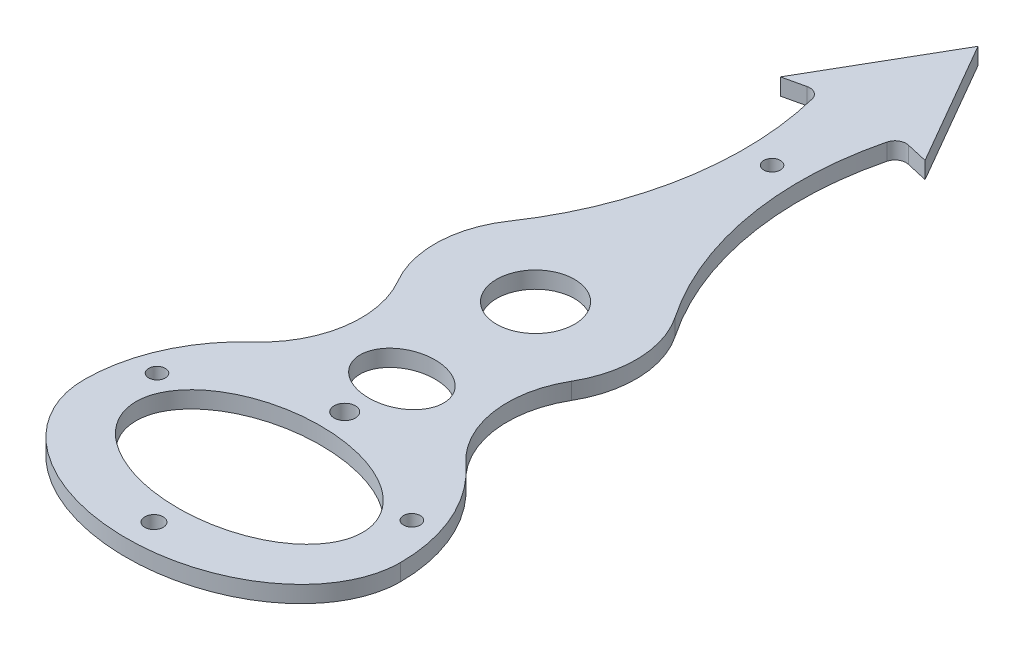
ISO-10303-21;
HEADER;
FILE_DESCRIPTION(('STEP AP214'),'2;1');
FILE_NAME('part.step','',(''),(''),'','','');
FILE_SCHEMA(('AUTOMOTIVE_DESIGN { 1 0 10303 214 1 1 1 1 }'));
ENDSEC;
DATA;
#1=APPLICATION_CONTEXT('core data for automotive mechanical design processes');
#2=APPLICATION_PROTOCOL_DEFINITION('international standard','automotive_design',2000,#1);
#3=PRODUCT_CONTEXT('',#1,'mechanical');
#4=PRODUCT('Part','Part','',(#3));
#5=PRODUCT_RELATED_PRODUCT_CATEGORY('part','',(#4));
#6=PRODUCT_DEFINITION_FORMATION('','',#4);
#7=PRODUCT_DEFINITION_CONTEXT('part definition',#1,'design');
#8=PRODUCT_DEFINITION('design','',#6,#7);
#9=PRODUCT_DEFINITION_SHAPE('','',#8);
#10=(LENGTH_UNIT() NAMED_UNIT(*) SI_UNIT(.MILLI.,.METRE.));
#11=(NAMED_UNIT(*) PLANE_ANGLE_UNIT() SI_UNIT($,.RADIAN.));
#12=(NAMED_UNIT(*) SI_UNIT($,.STERADIAN.) SOLID_ANGLE_UNIT());
#13=UNCERTAINTY_MEASURE_WITH_UNIT(LENGTH_MEASURE(1.E-05),#10,'distance_accuracy_value','');
#14=(GEOMETRIC_REPRESENTATION_CONTEXT(3) GLOBAL_UNCERTAINTY_ASSIGNED_CONTEXT((#13)) GLOBAL_UNIT_ASSIGNED_CONTEXT((#10,
#11,#12)) REPRESENTATION_CONTEXT('',''));
#15=CARTESIAN_POINT('',(0.,0.,0.));
#16=DIRECTION('',(0.,0.,1.));
#17=DIRECTION('',(1.,0.,0.));
#18=AXIS2_PLACEMENT_3D('',#15,#16,#17);
#19=CARTESIAN_POINT('',(0.,3.,52.6898309283418));
#20=DIRECTION('',(0.,-1.,0.));
#21=DIRECTION('',(0.,0.,-1.));
#22=AXIS2_PLACEMENT_3D('',#19,#20,#21);
#23=PLANE('',#22);
#24=CARTESIAN_POINT('',(0.,3.,51.4172932330827));
#25=DIRECTION('',(0.,1.,0.));
#26=DIRECTION('',(1.,0.,0.));
#27=AXIS2_PLACEMENT_3D('',#24,#25,#26);
#28=ELLIPSE('',#27,20.3627513784206,12.8129502592751);
#29=CARTESIAN_POINT('',(20.3627513784206,3.,51.4172932330827));
#30=VERTEX_POINT('',#29);
#31=EDGE_CURVE('E400',#30,#30,#28,.T.);
#32=ORIENTED_EDGE('',*,*,#31,.F.);
#33=EDGE_LOOP('',(#32));
#34=FACE_BOUND('',#33,.T.);
#35=CARTESIAN_POINT('',(0.,3.,24.0072199359122));
#36=DIRECTION('',(0.,1.,0.));
#37=DIRECTION('',(-1.,0.,0.));
#38=AXIS2_PLACEMENT_3D('',#35,#36,#37);
#39=ELLIPSE('',#38,7.5,5.94482806772379);
#40=CARTESIAN_POINT('',(-7.5,3.,24.0072199359122));
#41=VERTEX_POINT('',#40);
#42=EDGE_CURVE('E393',#41,#41,#39,.T.);
#43=ORIENTED_EDGE('',*,*,#42,.F.);
#44=EDGE_LOOP('',(#43));
#45=FACE_BOUND('',#44,.T.);
#46=DIRECTION('',(0.974987658580331,0.,-0.222259005702906));
#47=VECTOR('',#46,1.);
#48=CARTESIAN_POINT('',(-12.99280916861,3.,-56.9957943869207));
#49=LINE('',#48,#47);
#50=CARTESIAN_POINT('',(-12.99280916861,3.,-56.9957943869207));
#51=VERTEX_POINT('',#50);
#52=CARTESIAN_POINT('',(-9.09285853428872,3.,-57.8848304097323));
#53=VERTEX_POINT('',#52);
#54=EDGE_CURVE('E202',#51,#53,#49,.T.);
#55=ORIENTED_EDGE('',*,*,#54,.T.);
#56=CARTESIAN_POINT('',(-8.6483405228829,3.,-55.9348550925716));
#57=DIRECTION('',(0.,-1.,0.));
#58=DIRECTION('',(0.,0.,-1.));
#59=AXIS2_PLACEMENT_3D('',#56,#57,#58);
#60=CIRCLE('',#59,2.00000000000003);
#61=CARTESIAN_POINT('',(-6.70763481825483,3.,-56.4182404130193));
#62=VERTEX_POINT('',#61);
#63=EDGE_CURVE('E115',#53,#62,#60,.T.);
#64=ORIENTED_EDGE('',*,*,#63,.T.);
#65=CARTESIAN_POINT('',(-62.598620829956,3.,-42.4970765194051));
#66=DIRECTION('',(0.,-1.,0.));
#67=DIRECTION('',(0.,0.,1.));
#68=AXIS2_PLACEMENT_3D('',#65,#66,#67);
#69=CIRCLE('',#68,57.598620829956);
#70=CARTESIAN_POINT('',(-14.9440349728036,3.,-10.1452362580485));
#71=VERTEX_POINT('',#70);
#72=EDGE_CURVE('E238',#62,#71,#69,.T.);
#73=ORIENTED_EDGE('',*,*,#72,.T.);
#74=CARTESIAN_POINT('',(0.,3.,0.));
#75=DIRECTION('',(0.,1.,0.));
#76=DIRECTION('',(0.,0.,-1.));
#77=AXIS2_PLACEMENT_3D('',#74,#75,#76);
#78=CIRCLE('',#77,18.0623918681885);
#79=CARTESIAN_POINT('',(-15.6011791105288,3.,9.1023738860366));
#80=VERTEX_POINT('',#79);
#81=EDGE_CURVE('E257',#71,#80,#78,.T.);
#82=ORIENTED_EDGE('',*,*,#81,.T.);
#83=CARTESIAN_POINT('',(-31.2023582210575,3.,18.2047477720732));
#84=DIRECTION('',(0.,-1.,0.));
#85=DIRECTION('',(0.,0.,1.));
#86=AXIS2_PLACEMENT_3D('',#83,#84,#85);
#87=CIRCLE('',#86,18.0623918681884);
#88=CARTESIAN_POINT('',(-19.0837238382742,3.,31.5983544818591));
#89=VERTEX_POINT('',#88);
#90=EDGE_CURVE('E254',#80,#89,#87,.T.);
#91=ORIENTED_EDGE('',*,*,#90,.T.);
#92=CARTESIAN_POINT('',(5.41233724504764E-13,3.,52.6898309283421));
#93=DIRECTION('',(0.,1.,0.));
#94=DIRECTION('',(0.,0.,1.));
#95=AXIS2_PLACEMENT_3D('',#92,#93,#94);
#96=CIRCLE('',#95,28.4436090225569);
#97=CARTESIAN_POINT('',(-28.4436090225564,3.,52.6898309283423));
#98=VERTEX_POINT('',#97);
#99=EDGE_CURVE('E256',#89,#98,#96,.T.);
#100=ORIENTED_EDGE('',*,*,#99,.T.);
#101=CARTESIAN_POINT('',(0.,3.,52.6898309283418));
#102=DIRECTION('',(0.,1.,0.));
#103=DIRECTION('',(-1.,0.,0.));
#104=AXIS2_PLACEMENT_3D('',#101,#102,#103);
#105=ELLIPSE('',#104,28.4436090225564,20.8665600491018);
#106=CARTESIAN_POINT('',(28.4436090225566,3.,52.6898309283418));
#107=VERTEX_POINT('',#106);
#108=EDGE_CURVE('E259',#98,#107,#105,.T.);
#109=ORIENTED_EDGE('',*,*,#108,.T.);
#110=CARTESIAN_POINT('',(5.41233724504764E-13,3.,52.6898309283421));
#111=DIRECTION('',(0.,1.,0.));
#112=DIRECTION('',(0.,0.,-1.));
#113=AXIS2_PLACEMENT_3D('',#110,#111,#112);
#114=CIRCLE('',#113,28.443609022556);
#115=CARTESIAN_POINT('',(19.0837238382742,3.,31.5983544818591));
#116=VERTEX_POINT('',#115);
#117=EDGE_CURVE('E266',#107,#116,#114,.T.);
#118=ORIENTED_EDGE('',*,*,#117,.T.);
#119=CARTESIAN_POINT('',(31.2023582210575,3.,18.2047477720732));
#120=DIRECTION('',(0.,-1.,0.));
#121=DIRECTION('',(0.,0.,-1.));
#122=AXIS2_PLACEMENT_3D('',#119,#120,#121);
#123=CIRCLE('',#122,18.0623918681884);
#124=CARTESIAN_POINT('',(15.6011791105288,3.,9.1023738860366));
#125=VERTEX_POINT('',#124);
#126=EDGE_CURVE('E346',#116,#125,#123,.T.);
#127=ORIENTED_EDGE('',*,*,#126,.T.);
#128=CARTESIAN_POINT('',(0.,3.,0.));
#129=DIRECTION('',(0.,1.,0.));
#130=DIRECTION('',(0.,0.,1.));
#131=AXIS2_PLACEMENT_3D('',#128,#129,#130);
#132=CIRCLE('',#131,18.0623918681884);
#133=CARTESIAN_POINT('',(14.9440349728036,3.,-10.1452362580485));
#134=VERTEX_POINT('',#133);
#135=EDGE_CURVE('E338',#125,#134,#132,.T.);
#136=ORIENTED_EDGE('',*,*,#135,.T.);
#137=CARTESIAN_POINT('',(62.598620829956,3.,-42.4970765194051));
#138=DIRECTION('',(0.,-1.,0.));
#139=DIRECTION('',(0.,0.,-1.));
#140=AXIS2_PLACEMENT_3D('',#137,#138,#139);
#141=CIRCLE('',#140,57.598620829956);
#142=CARTESIAN_POINT('',(6.70763481825485,3.,-56.4182404130193));
#143=VERTEX_POINT('',#142);
#144=EDGE_CURVE('E343',#134,#143,#141,.T.);
#145=ORIENTED_EDGE('',*,*,#144,.T.);
#146=CARTESIAN_POINT('',(8.6483405228829,3.,-55.9348550925716));
#147=DIRECTION('',(0.,-1.,0.));
#148=DIRECTION('',(0.,0.,1.));
#149=AXIS2_PLACEMENT_3D('',#146,#147,#148);
#150=CIRCLE('',#149,2.00000000000003);
#151=CARTESIAN_POINT('',(9.09285853428871,3.,-57.8848304097323));
#152=VERTEX_POINT('',#151);
#153=EDGE_CURVE('E155',#143,#152,#150,.T.);
#154=ORIENTED_EDGE('',*,*,#153,.T.);
#155=DIRECTION('',(0.974987658580331,0.,0.222259005702906));
#156=VECTOR('',#155,1.);
#157=CARTESIAN_POINT('',(12.99280916861,3.,-56.9957943869207));
#158=LINE('',#157,#156);
#159=CARTESIAN_POINT('',(12.99280916861,3.,-56.9957943869207));
#160=VERTEX_POINT('',#159);
#161=EDGE_CURVE('E149',#152,#160,#158,.T.);
#162=ORIENTED_EDGE('',*,*,#161,.T.);
#163=DIRECTION('',(-0.5,0.,-0.866025403784439));
#164=VECTOR('',#163,1.);
#165=CARTESIAN_POINT('',(0.,3.,-79.5));
#166=LINE('',#165,#164);
#167=CARTESIAN_POINT('',(0.,3.,-79.5));
#168=VERTEX_POINT('',#167);
#169=EDGE_CURVE('E153',#160,#168,#166,.T.);
#170=ORIENTED_EDGE('',*,*,#169,.T.);
#171=DIRECTION('',(-0.5,0.,0.866025403784439));
#172=VECTOR('',#171,1.);
#173=CARTESIAN_POINT('',(-12.99280916861,3.,-56.9957943869207));
#174=LINE('',#173,#172);
#175=EDGE_CURVE('E51',#168,#51,#174,.T.);
#176=ORIENTED_EDGE('',*,*,#175,.T.);
#177=EDGE_LOOP('',(#55,#64,#73,#82,#91,#100,#109,#118,#127,#136,#145,#154,#162,#170,#176));
#178=FACE_BOUND('',#177,.T.);
#179=CARTESIAN_POINT('',(0.,3.,68.5563909774436));
#180=DIRECTION('',(0.,1.,0.));
#181=DIRECTION('',(0.,0.,1.));
#182=AXIS2_PLACEMENT_3D('',#179,#180,#181);
#183=CIRCLE('',#182,1.65);
#184=CARTESIAN_POINT('',(0.,3.,70.2063909774436));
#185=VERTEX_POINT('',#184);
#186=EDGE_CURVE('E177',#185,#185,#183,.T.);
#187=ORIENTED_EDGE('',*,*,#186,.F.);
#188=EDGE_LOOP('',(#187));
#189=FACE_BOUND('',#188,.T.);
#190=CARTESIAN_POINT('',(-22.8961495005631,3.,45.1123452596495));
#191=DIRECTION('',(0.,1.,0.));
#192=DIRECTION('',(0.,0.,1.));
#193=AXIS2_PLACEMENT_3D('',#190,#191,#192);
#194=CIRCLE('',#193,1.5);
#195=CARTESIAN_POINT('',(-22.8961495005631,3.,46.6123452596495));
#196=VERTEX_POINT('',#195);
#197=EDGE_CURVE('E360',#196,#196,#194,.T.);
#198=ORIENTED_EDGE('',*,*,#197,.F.);
#199=EDGE_LOOP('',(#198));
#200=FACE_BOUND('',#199,.T.);
#201=CARTESIAN_POINT('',(22.8961495005631,3.,45.1123452596495));
#202=DIRECTION('',(0.,1.,0.));
#203=DIRECTION('',(0.,0.,-1.));
#204=AXIS2_PLACEMENT_3D('',#201,#202,#203);
#205=CIRCLE('',#204,1.5);
#206=CARTESIAN_POINT('',(22.8961495005631,3.,43.6123452596495));
#207=VERTEX_POINT('',#206);
#208=EDGE_CURVE('E366',#207,#207,#205,.T.);
#209=ORIENTED_EDGE('',*,*,#208,.F.);
#210=EDGE_LOOP('',(#209));
#211=FACE_BOUND('',#210,.T.);
#212=CARTESIAN_POINT('',(0.,3.,0.));
#213=DIRECTION('',(0.,1.,0.));
#214=DIRECTION('',(0.,0.,1.));
#215=AXIS2_PLACEMENT_3D('',#212,#213,#214);
#216=CIRCLE('',#215,7.);
#217=CARTESIAN_POINT('',(0.,3.,7.));
#218=VERTEX_POINT('',#217);
#219=EDGE_CURVE('E372',#218,#218,#216,.T.);
#220=ORIENTED_EDGE('',*,*,#219,.F.);
#221=EDGE_LOOP('',(#220));
#222=FACE_BOUND('',#221,.T.);
#223=CARTESIAN_POINT('',(0.,3.,-42.4970765194051));
#224=DIRECTION('',(0.,1.,0.));
#225=DIRECTION('',(0.,0.,1.));
#226=AXIS2_PLACEMENT_3D('',#223,#224,#225);
#227=CIRCLE('',#226,1.5);
#228=CARTESIAN_POINT('',(0.,3.,-40.9970765194051));
#229=VERTEX_POINT('',#228);
#230=EDGE_CURVE('E378',#229,#229,#227,.T.);
#231=ORIENTED_EDGE('',*,*,#230,.F.);
#232=EDGE_LOOP('',(#231));
#233=FACE_BOUND('',#232,.T.);
#234=CARTESIAN_POINT('',(0.,3.,34.2781954887218));
#235=DIRECTION('',(0.,1.,0.));
#236=DIRECTION('',(0.,0.,1.));
#237=AXIS2_PLACEMENT_3D('',#234,#235,#236);
#238=CIRCLE('',#237,1.90918830920368);
#239=CARTESIAN_POINT('',(0.,3.,36.1873837979255));
#240=VERTEX_POINT('',#239);
#241=EDGE_CURVE('E384',#240,#240,#238,.T.);
#242=ORIENTED_EDGE('',*,*,#241,.F.);
#243=EDGE_LOOP('',(#242));
#244=FACE_BOUND('',#243,.T.);
#245=ADVANCED_FACE('F34',(#34,#45,#178,#189,#200,#211,#222,#233,#244),#23,.F.);
#246=CARTESIAN_POINT('',(0.,0.,52.6898309283418));
#247=DIRECTION('',(0.,-1.,0.));
#248=DIRECTION('',(0.,0.,-1.));
#249=AXIS2_PLACEMENT_3D('',#246,#247,#248);
#250=PLANE('',#249);
#251=CARTESIAN_POINT('',(0.,0.,51.4172932330827));
#252=DIRECTION('',(0.,1.,0.));
#253=DIRECTION('',(1.,0.,0.));
#254=AXIS2_PLACEMENT_3D('',#251,#252,#253);
#255=ELLIPSE('',#254,20.3627513784206,12.8129502592751);
#256=CARTESIAN_POINT('',(20.3627513784206,0.,51.4172932330827));
#257=VERTEX_POINT('',#256);
#258=EDGE_CURVE('E390',#257,#257,#255,.T.);
#259=ORIENTED_EDGE('',*,*,#258,.T.);
#260=EDGE_LOOP('',(#259));
#261=FACE_BOUND('',#260,.T.);
#262=CARTESIAN_POINT('',(0.,0.,24.0072199359122));
#263=DIRECTION('',(0.,1.,0.));
#264=DIRECTION('',(-1.,0.,0.));
#265=AXIS2_PLACEMENT_3D('',#262,#263,#264);
#266=ELLIPSE('',#265,7.5,5.94482806772379);
#267=CARTESIAN_POINT('',(-7.5,0.,24.0072199359122));
#268=VERTEX_POINT('',#267);
#269=EDGE_CURVE('E396',#268,#268,#266,.T.);
#270=ORIENTED_EDGE('',*,*,#269,.T.);
#271=EDGE_LOOP('',(#270));
#272=FACE_BOUND('',#271,.T.);
#273=CARTESIAN_POINT('',(0.,0.,-42.4970765194051));
#274=DIRECTION('',(0.,1.,0.));
#275=DIRECTION('',(0.,0.,1.));
#276=AXIS2_PLACEMENT_3D('',#273,#274,#275);
#277=CIRCLE('',#276,1.5);
#278=CARTESIAN_POINT('',(0.,0.,-40.9970765194051));
#279=VERTEX_POINT('',#278);
#280=EDGE_CURVE('E381',#279,#279,#277,.T.);
#281=ORIENTED_EDGE('',*,*,#280,.T.);
#282=EDGE_LOOP('',(#281));
#283=FACE_BOUND('',#282,.T.);
#284=CARTESIAN_POINT('',(22.8961495005631,0.,45.1123452596495));
#285=DIRECTION('',(0.,1.,0.));
#286=DIRECTION('',(0.,0.,-1.));
#287=AXIS2_PLACEMENT_3D('',#284,#285,#286);
#288=CIRCLE('',#287,1.5);
#289=CARTESIAN_POINT('',(22.8961495005631,0.,43.6123452596495));
#290=VERTEX_POINT('',#289);
#291=EDGE_CURVE('E369',#290,#290,#288,.T.);
#292=ORIENTED_EDGE('',*,*,#291,.T.);
#293=EDGE_LOOP('',(#292));
#294=FACE_BOUND('',#293,.T.);
#295=CARTESIAN_POINT('',(0.,0.,68.5563909774436));
#296=DIRECTION('',(0.,1.,0.));
#297=DIRECTION('',(0.,0.,1.));
#298=AXIS2_PLACEMENT_3D('',#295,#296,#297);
#299=CIRCLE('',#298,1.65);
#300=CARTESIAN_POINT('',(0.,0.,70.2063909774436));
#301=VERTEX_POINT('',#300);
#302=EDGE_CURVE('E357',#301,#301,#299,.T.);
#303=ORIENTED_EDGE('',*,*,#302,.T.);
#304=EDGE_LOOP('',(#303));
#305=FACE_BOUND('',#304,.T.);
#306=DIRECTION('',(0.974987658580331,0.,-0.222259005702906));
#307=VECTOR('',#306,1.);
#308=CARTESIAN_POINT('',(-12.99280916861,0.,-56.9957943869207));
#309=LINE('',#308,#307);
#310=CARTESIAN_POINT('',(-12.99280916861,0.,-56.9957943869207));
#311=VERTEX_POINT('',#310);
#312=CARTESIAN_POINT('',(-9.09285853428872,0.,-57.8848304097323));
#313=VERTEX_POINT('',#312);
#314=EDGE_CURVE('E173',#311,#313,#309,.T.);
#315=ORIENTED_EDGE('',*,*,#314,.F.);
#316=DIRECTION('',(-0.5,0.,0.866025403784439));
#317=VECTOR('',#316,1.);
#318=CARTESIAN_POINT('',(-12.99280916861,0.,-56.9957943869207));
#319=LINE('',#318,#317);
#320=CARTESIAN_POINT('',(0.,0.,-79.5));
#321=VERTEX_POINT('',#320);
#322=EDGE_CURVE('E107',#321,#311,#319,.T.);
#323=ORIENTED_EDGE('',*,*,#322,.F.);
#324=DIRECTION('',(-0.5,0.,-0.866025403784439));
#325=VECTOR('',#324,1.);
#326=CARTESIAN_POINT('',(0.,0.,-79.5));
#327=LINE('',#326,#325);
#328=CARTESIAN_POINT('',(12.99280916861,0.,-56.9957943869207));
#329=VERTEX_POINT('',#328);
#330=EDGE_CURVE('E101',#329,#321,#327,.T.);
#331=ORIENTED_EDGE('',*,*,#330,.F.);
#332=DIRECTION('',(0.974987658580331,0.,0.222259005702906));
#333=VECTOR('',#332,1.);
#334=CARTESIAN_POINT('',(12.99280916861,0.,-56.9957943869207));
#335=LINE('',#334,#333);
#336=CARTESIAN_POINT('',(9.09285853428871,0.,-57.8848304097323));
#337=VERTEX_POINT('',#336);
#338=EDGE_CURVE('E163',#337,#329,#335,.T.);
#339=ORIENTED_EDGE('',*,*,#338,.F.);
#340=CARTESIAN_POINT('',(8.6483405228829,0.,-55.9348550925716));
#341=DIRECTION('',(0.,-1.,0.));
#342=DIRECTION('',(0.,0.,1.));
#343=AXIS2_PLACEMENT_3D('',#340,#341,#342);
#344=CIRCLE('',#343,2.00000000000003);
#345=CARTESIAN_POINT('',(6.70763481825485,0.,-56.4182404130193));
#346=VERTEX_POINT('',#345);
#347=EDGE_CURVE('E197',#346,#337,#344,.T.);
#348=ORIENTED_EDGE('',*,*,#347,.F.);
#349=CARTESIAN_POINT('',(62.598620829956,0.,-42.4970765194051));
#350=DIRECTION('',(0.,-1.,0.));
#351=DIRECTION('',(0.,0.,-1.));
#352=AXIS2_PLACEMENT_3D('',#349,#350,#351);
#353=CIRCLE('',#352,57.598620829956);
#354=CARTESIAN_POINT('',(14.9440349728036,0.,-10.1452362580485));
#355=VERTEX_POINT('',#354);
#356=EDGE_CURVE('E195',#355,#346,#353,.T.);
#357=ORIENTED_EDGE('',*,*,#356,.F.);
#358=CARTESIAN_POINT('',(0.,0.,0.));
#359=DIRECTION('',(0.,1.,0.));
#360=DIRECTION('',(0.,0.,1.));
#361=AXIS2_PLACEMENT_3D('',#358,#359,#360);
#362=CIRCLE('',#361,18.0623918681884);
#363=CARTESIAN_POINT('',(15.6011791105288,0.,9.1023738860366));
#364=VERTEX_POINT('',#363);
#365=EDGE_CURVE('E193',#364,#355,#362,.T.);
#366=ORIENTED_EDGE('',*,*,#365,.F.);
#367=CARTESIAN_POINT('',(31.2023582210575,0.,18.2047477720732));
#368=DIRECTION('',(0.,-1.,0.));
#369=DIRECTION('',(0.,0.,-1.));
#370=AXIS2_PLACEMENT_3D('',#367,#368,#369);
#371=CIRCLE('',#370,18.0623918681884);
#372=CARTESIAN_POINT('',(19.0837238382742,0.,31.5983544818591));
#373=VERTEX_POINT('',#372);
#374=EDGE_CURVE('E191',#373,#364,#371,.T.);
#375=ORIENTED_EDGE('',*,*,#374,.F.);
#376=CARTESIAN_POINT('',(5.41233724504764E-13,0.,52.6898309283421));
#377=DIRECTION('',(0.,1.,0.));
#378=DIRECTION('',(0.,0.,-1.));
#379=AXIS2_PLACEMENT_3D('',#376,#377,#378);
#380=CIRCLE('',#379,28.443609022556);
#381=CARTESIAN_POINT('',(28.4436090225566,0.,52.6898309283418));
#382=VERTEX_POINT('',#381);
#383=EDGE_CURVE('E189',#382,#373,#380,.T.);
#384=ORIENTED_EDGE('',*,*,#383,.F.);
#385=CARTESIAN_POINT('',(0.,0.,52.6898309283418));
#386=DIRECTION('',(0.,1.,0.));
#387=DIRECTION('',(-1.,0.,0.));
#388=AXIS2_PLACEMENT_3D('',#385,#386,#387);
#389=ELLIPSE('',#388,28.4436090225564,20.8665600491018);
#390=CARTESIAN_POINT('',(-28.4436090225564,0.,52.6898309283423));
#391=VERTEX_POINT('',#390);
#392=EDGE_CURVE('E187',#391,#382,#389,.T.);
#393=ORIENTED_EDGE('',*,*,#392,.F.);
#394=CARTESIAN_POINT('',(5.41233724504764E-13,0.,52.6898309283421));
#395=DIRECTION('',(0.,1.,0.));
#396=DIRECTION('',(0.,0.,1.));
#397=AXIS2_PLACEMENT_3D('',#394,#395,#396);
#398=CIRCLE('',#397,28.4436090225569);
#399=CARTESIAN_POINT('',(-19.0837238382742,0.,31.5983544818591));
#400=VERTEX_POINT('',#399);
#401=EDGE_CURVE('E185',#400,#391,#398,.T.);
#402=ORIENTED_EDGE('',*,*,#401,.F.);
#403=CARTESIAN_POINT('',(-31.2023582210575,0.,18.2047477720732));
#404=DIRECTION('',(0.,-1.,0.));
#405=DIRECTION('',(0.,0.,1.));
#406=AXIS2_PLACEMENT_3D('',#403,#404,#405);
#407=CIRCLE('',#406,18.0623918681884);
#408=CARTESIAN_POINT('',(-15.6011791105288,0.,9.1023738860366));
#409=VERTEX_POINT('',#408);
#410=EDGE_CURVE('E183',#409,#400,#407,.T.);
#411=ORIENTED_EDGE('',*,*,#410,.F.);
#412=CARTESIAN_POINT('',(0.,0.,0.));
#413=DIRECTION('',(0.,1.,0.));
#414=DIRECTION('',(0.,0.,-1.));
#415=AXIS2_PLACEMENT_3D('',#412,#413,#414);
#416=CIRCLE('',#415,18.0623918681885);
#417=CARTESIAN_POINT('',(-14.9440349728036,0.,-10.1452362580485));
#418=VERTEX_POINT('',#417);
#419=EDGE_CURVE('E181',#418,#409,#416,.T.);
#420=ORIENTED_EDGE('',*,*,#419,.F.);
#421=CARTESIAN_POINT('',(-62.598620829956,0.,-42.4970765194051));
#422=DIRECTION('',(0.,-1.,0.));
#423=DIRECTION('',(0.,0.,1.));
#424=AXIS2_PLACEMENT_3D('',#421,#422,#423);
#425=CIRCLE('',#424,57.598620829956);
#426=CARTESIAN_POINT('',(-6.70763481825483,0.,-56.4182404130193));
#427=VERTEX_POINT('',#426);
#428=EDGE_CURVE('E179',#427,#418,#425,.T.);
#429=ORIENTED_EDGE('',*,*,#428,.F.);
#430=CARTESIAN_POINT('',(-8.6483405228829,0.,-55.9348550925716));
#431=DIRECTION('',(0.,-1.,0.));
#432=DIRECTION('',(0.,0.,-1.));
#433=AXIS2_PLACEMENT_3D('',#430,#431,#432);
#434=CIRCLE('',#433,2.00000000000003);
#435=EDGE_CURVE('E176',#313,#427,#434,.T.);
#436=ORIENTED_EDGE('',*,*,#435,.F.);
#437=EDGE_LOOP('',(#315,#323,#331,#339,#348,#357,#366,#375,#384,#393,#402,#411,#420,#429,#436));
#438=FACE_BOUND('',#437,.T.);
#439=CARTESIAN_POINT('',(-22.8961495005631,0.,45.1123452596495));
#440=DIRECTION('',(0.,1.,0.));
#441=DIRECTION('',(0.,0.,1.));
#442=AXIS2_PLACEMENT_3D('',#439,#440,#441);
#443=CIRCLE('',#442,1.5);
#444=CARTESIAN_POINT('',(-22.8961495005631,0.,46.6123452596495));
#445=VERTEX_POINT('',#444);
#446=EDGE_CURVE('E363',#445,#445,#443,.T.);
#447=ORIENTED_EDGE('',*,*,#446,.T.);
#448=EDGE_LOOP('',(#447));
#449=FACE_BOUND('',#448,.T.);
#450=CARTESIAN_POINT('',(0.,0.,0.));
#451=DIRECTION('',(0.,1.,0.));
#452=DIRECTION('',(0.,0.,1.));
#453=AXIS2_PLACEMENT_3D('',#450,#451,#452);
#454=CIRCLE('',#453,7.);
#455=CARTESIAN_POINT('',(0.,0.,7.));
#456=VERTEX_POINT('',#455);
#457=EDGE_CURVE('E375',#456,#456,#454,.T.);
#458=ORIENTED_EDGE('',*,*,#457,.T.);
#459=EDGE_LOOP('',(#458));
#460=FACE_BOUND('',#459,.T.);
#461=CARTESIAN_POINT('',(0.,0.,34.2781954887218));
#462=DIRECTION('',(0.,1.,0.));
#463=DIRECTION('',(0.,0.,1.));
#464=AXIS2_PLACEMENT_3D('',#461,#462,#463);
#465=CIRCLE('',#464,1.90918830920368);
#466=CARTESIAN_POINT('',(0.,0.,36.1873837979255));
#467=VERTEX_POINT('',#466);
#468=EDGE_CURVE('E387',#467,#467,#465,.T.);
#469=ORIENTED_EDGE('',*,*,#468,.T.);
#470=EDGE_LOOP('',(#469));
#471=FACE_BOUND('',#470,.T.);
#472=ADVANCED_FACE('F242',(#261,#272,#283,#294,#305,#438,#449,#460,#471),#250,.T.);
#473=CARTESIAN_POINT('',(-12.99280916861,3.,-56.9957943869207));
#474=DIRECTION('',(-0.222259005702906,0.,-0.974987658580331));
#475=DIRECTION('',(-0.974987658580331,0.,0.222259005702906));
#476=AXIS2_PLACEMENT_3D('',#473,#474,#475);
#477=PLANE('',#476);
#478=ORIENTED_EDGE('',*,*,#314,.T.);
#479=DIRECTION('',(0.,-1.,0.));
#480=VECTOR('',#479,1.);
#481=CARTESIAN_POINT('',(-9.09285853428872,3.,-57.8848304097323));
#482=LINE('',#481,#480);
#483=EDGE_CURVE('E11',#53,#313,#482,.T.);
#484=ORIENTED_EDGE('',*,*,#483,.F.);
#485=ORIENTED_EDGE('',*,*,#54,.F.);
#486=DIRECTION('',(0.,-1.,0.));
#487=VECTOR('',#486,1.);
#488=CARTESIAN_POINT('',(-12.99280916861,3.,-56.9957943869207));
#489=LINE('',#488,#487);
#490=EDGE_CURVE('E169',#51,#311,#489,.T.);
#491=ORIENTED_EDGE('',*,*,#490,.T.);
#492=EDGE_LOOP('',(#478,#484,#485,#491));
#493=FACE_BOUND('',#492,.T.);
#494=ADVANCED_FACE('F36',(#493),#477,.F.);
#495=CARTESIAN_POINT('',(-8.6483405228829,3.,-55.9348550925716));
#496=DIRECTION('',(0.,-1.,0.));
#497=DIRECTION('',(0.,0.,-1.));
#498=AXIS2_PLACEMENT_3D('',#495,#496,#497);
#499=CYLINDRICAL_SURFACE('',#498,2.00000000000003);
#500=ORIENTED_EDGE('',*,*,#435,.T.);
#501=DIRECTION('',(0.,-1.,0.));
#502=VECTOR('',#501,1.);
#503=CARTESIAN_POINT('',(-6.70763481825483,3.,-56.4182404130193));
#504=LINE('',#503,#502);
#505=EDGE_CURVE('E43',#62,#427,#504,.T.);
#506=ORIENTED_EDGE('',*,*,#505,.F.);
#507=ORIENTED_EDGE('',*,*,#63,.F.);
#508=ORIENTED_EDGE('',*,*,#483,.T.);
#509=EDGE_LOOP('',(#500,#506,#507,#508));
#510=FACE_BOUND('',#509,.T.);
#511=ADVANCED_FACE('F285',(#510),#499,.F.);
#512=CARTESIAN_POINT('',(-62.598620829956,3.,-42.4970765194051));
#513=DIRECTION('',(0.,-1.,0.));
#514=DIRECTION('',(0.,0.,-1.));
#515=AXIS2_PLACEMENT_3D('',#512,#513,#514);
#516=CYLINDRICAL_SURFACE('',#515,57.598620829956);
#517=ORIENTED_EDGE('',*,*,#428,.T.);
#518=DIRECTION('',(0.,-1.,0.));
#519=VECTOR('',#518,1.);
#520=CARTESIAN_POINT('',(-14.9440349728036,3.,-10.1452362580485));
#521=LINE('',#520,#519);
#522=EDGE_CURVE('E230',#71,#418,#521,.T.);
#523=ORIENTED_EDGE('',*,*,#522,.F.);
#524=ORIENTED_EDGE('',*,*,#72,.F.);
#525=ORIENTED_EDGE('',*,*,#505,.T.);
#526=EDGE_LOOP('',(#517,#523,#524,#525));
#527=FACE_BOUND('',#526,.T.);
#528=ADVANCED_FACE('F236',(#527),#516,.F.);
#529=CARTESIAN_POINT('',(0.,3.,0.));
#530=DIRECTION('',(0.,-1.,0.));
#531=DIRECTION('',(0.,0.,-1.));
#532=AXIS2_PLACEMENT_3D('',#529,#530,#531);
#533=CYLINDRICAL_SURFACE('',#532,18.0623918681885);
#534=ORIENTED_EDGE('',*,*,#419,.T.);
#535=DIRECTION('',(0.,-1.,0.));
#536=VECTOR('',#535,1.);
#537=CARTESIAN_POINT('',(-15.6011791105288,3.,9.1023738860366));
#538=LINE('',#537,#536);
#539=EDGE_CURVE('E227',#80,#409,#538,.T.);
#540=ORIENTED_EDGE('',*,*,#539,.F.);
#541=ORIENTED_EDGE('',*,*,#81,.F.);
#542=ORIENTED_EDGE('',*,*,#522,.T.);
#543=EDGE_LOOP('',(#534,#540,#541,#542));
#544=FACE_BOUND('',#543,.T.);
#545=ADVANCED_FACE('F248',(#544),#533,.T.);
#546=CARTESIAN_POINT('',(-31.2023582210575,3.,18.2047477720732));
#547=DIRECTION('',(0.,-1.,0.));
#548=DIRECTION('',(0.,0.,-1.));
#549=AXIS2_PLACEMENT_3D('',#546,#547,#548);
#550=CYLINDRICAL_SURFACE('',#549,18.0623918681884);
#551=ORIENTED_EDGE('',*,*,#410,.T.);
#552=DIRECTION('',(0.,-1.,0.));
#553=VECTOR('',#552,1.);
#554=CARTESIAN_POINT('',(-19.0837238382742,3.,31.5983544818591));
#555=LINE('',#554,#553);
#556=EDGE_CURVE('E224',#89,#400,#555,.T.);
#557=ORIENTED_EDGE('',*,*,#556,.F.);
#558=ORIENTED_EDGE('',*,*,#90,.F.);
#559=ORIENTED_EDGE('',*,*,#539,.T.);
#560=EDGE_LOOP('',(#551,#557,#558,#559));
#561=FACE_BOUND('',#560,.T.);
#562=ADVANCED_FACE('F252',(#561),#550,.F.);
#563=CARTESIAN_POINT('',(5.41233724504764E-13,3.,52.6898309283421));
#564=DIRECTION('',(0.,-1.,0.));
#565=DIRECTION('',(0.,0.,-1.));
#566=AXIS2_PLACEMENT_3D('',#563,#564,#565);
#567=CYLINDRICAL_SURFACE('',#566,28.4436090225569);
#568=ORIENTED_EDGE('',*,*,#401,.T.);
#569=DIRECTION('',(0.,-1.,0.));
#570=VECTOR('',#569,1.);
#571=CARTESIAN_POINT('',(-28.4436090225564,3.,52.6898309283423));
#572=LINE('',#571,#570);
#573=EDGE_CURVE('E221',#98,#391,#572,.T.);
#574=ORIENTED_EDGE('',*,*,#573,.F.);
#575=ORIENTED_EDGE('',*,*,#99,.F.);
#576=ORIENTED_EDGE('',*,*,#556,.T.);
#577=EDGE_LOOP('',(#568,#574,#575,#576));
#578=FACE_BOUND('',#577,.T.);
#579=ADVANCED_FACE('F274',(#578),#567,.T.);
#580=DIRECTION('',(0.,-1.,0.));
#581=VECTOR('',#580,1.);
#582=SURFACE_OF_LINEAR_EXTRUSION('',#105,#581);
#583=ORIENTED_EDGE('',*,*,#392,.T.);
#584=DIRECTION('',(0.,-1.,0.));
#585=VECTOR('',#584,1.);
#586=CARTESIAN_POINT('',(28.4436090225566,3.,52.6898309283418));
#587=LINE('',#586,#585);
#588=EDGE_CURVE('E218',#107,#382,#587,.T.);
#589=ORIENTED_EDGE('',*,*,#588,.F.);
#590=ORIENTED_EDGE('',*,*,#108,.F.);
#591=ORIENTED_EDGE('',*,*,#573,.T.);
#592=EDGE_LOOP('',(#583,#589,#590,#591));
#593=FACE_BOUND('',#592,.T.);
#594=ADVANCED_FACE('F269',(#593),#582,.F.);
#595=CARTESIAN_POINT('',(5.41233724504764E-13,3.,52.6898309283421));
#596=DIRECTION('',(0.,-1.,0.));
#597=DIRECTION('',(0.,0.,-1.));
#598=AXIS2_PLACEMENT_3D('',#595,#596,#597);
#599=CYLINDRICAL_SURFACE('',#598,28.443609022556);
#600=ORIENTED_EDGE('',*,*,#383,.T.);
#601=DIRECTION('',(0.,-1.,0.));
#602=VECTOR('',#601,1.);
#603=CARTESIAN_POINT('',(19.0837238382742,3.,31.5983544818591));
#604=LINE('',#603,#602);
#605=EDGE_CURVE('E215',#116,#373,#604,.T.);
#606=ORIENTED_EDGE('',*,*,#605,.F.);
#607=ORIENTED_EDGE('',*,*,#117,.F.);
#608=ORIENTED_EDGE('',*,*,#588,.T.);
#609=EDGE_LOOP('',(#600,#606,#607,#608));
#610=FACE_BOUND('',#609,.T.);
#611=ADVANCED_FACE('F273',(#610),#599,.T.);
#612=CARTESIAN_POINT('',(31.2023582210575,3.,18.2047477720732));
#613=DIRECTION('',(0.,-1.,0.));
#614=DIRECTION('',(0.,0.,-1.));
#615=AXIS2_PLACEMENT_3D('',#612,#613,#614);
#616=CYLINDRICAL_SURFACE('',#615,18.0623918681884);
#617=ORIENTED_EDGE('',*,*,#374,.T.);
#618=DIRECTION('',(0.,-1.,0.));
#619=VECTOR('',#618,1.);
#620=CARTESIAN_POINT('',(15.6011791105288,3.,9.1023738860366));
#621=LINE('',#620,#619);
#622=EDGE_CURVE('E212',#125,#364,#621,.T.);
#623=ORIENTED_EDGE('',*,*,#622,.F.);
#624=ORIENTED_EDGE('',*,*,#126,.F.);
#625=ORIENTED_EDGE('',*,*,#605,.T.);
#626=EDGE_LOOP('',(#617,#623,#624,#625));
#627=FACE_BOUND('',#626,.T.);
#628=ADVANCED_FACE('F322',(#627),#616,.F.);
#629=CARTESIAN_POINT('',(0.,3.,0.));
#630=DIRECTION('',(0.,-1.,0.));
#631=DIRECTION('',(0.,0.,-1.));
#632=AXIS2_PLACEMENT_3D('',#629,#630,#631);
#633=CYLINDRICAL_SURFACE('',#632,18.0623918681884);
#634=ORIENTED_EDGE('',*,*,#365,.T.);
#635=DIRECTION('',(0.,-1.,0.));
#636=VECTOR('',#635,1.);
#637=CARTESIAN_POINT('',(14.9440349728036,3.,-10.1452362580485));
#638=LINE('',#637,#636);
#639=EDGE_CURVE('E209',#134,#355,#638,.T.);
#640=ORIENTED_EDGE('',*,*,#639,.F.);
#641=ORIENTED_EDGE('',*,*,#135,.F.);
#642=ORIENTED_EDGE('',*,*,#622,.T.);
#643=EDGE_LOOP('',(#634,#640,#641,#642));
#644=FACE_BOUND('',#643,.T.);
#645=ADVANCED_FACE('F319',(#644),#633,.T.);
#646=CARTESIAN_POINT('',(62.598620829956,3.,-42.4970765194051));
#647=DIRECTION('',(0.,-1.,0.));
#648=DIRECTION('',(0.,0.,-1.));
#649=AXIS2_PLACEMENT_3D('',#646,#647,#648);
#650=CYLINDRICAL_SURFACE('',#649,57.598620829956);
#651=ORIENTED_EDGE('',*,*,#356,.T.);
#652=DIRECTION('',(0.,-1.,0.));
#653=VECTOR('',#652,1.);
#654=CARTESIAN_POINT('',(6.70763481825485,3.,-56.4182404130193));
#655=LINE('',#654,#653);
#656=EDGE_CURVE('E206',#143,#346,#655,.T.);
#657=ORIENTED_EDGE('',*,*,#656,.F.);
#658=ORIENTED_EDGE('',*,*,#144,.F.);
#659=ORIENTED_EDGE('',*,*,#639,.T.);
#660=EDGE_LOOP('',(#651,#657,#658,#659));
#661=FACE_BOUND('',#660,.T.);
#662=ADVANCED_FACE('F315',(#661),#650,.F.);
#663=CARTESIAN_POINT('',(8.6483405228829,3.,-55.9348550925716));
#664=DIRECTION('',(0.,-1.,0.));
#665=DIRECTION('',(0.,0.,-1.));
#666=AXIS2_PLACEMENT_3D('',#663,#664,#665);
#667=CYLINDRICAL_SURFACE('',#666,2.00000000000003);
#668=ORIENTED_EDGE('',*,*,#347,.T.);
#669=DIRECTION('',(0.,-1.,0.));
#670=VECTOR('',#669,1.);
#671=CARTESIAN_POINT('',(9.09285853428871,3.,-57.8848304097323));
#672=LINE('',#671,#670);
#673=EDGE_CURVE('E164',#152,#337,#672,.T.);
#674=ORIENTED_EDGE('',*,*,#673,.F.);
#675=ORIENTED_EDGE('',*,*,#153,.F.);
#676=ORIENTED_EDGE('',*,*,#656,.T.);
#677=EDGE_LOOP('',(#668,#674,#675,#676));
#678=FACE_BOUND('',#677,.T.);
#679=ADVANCED_FACE('F312',(#678),#667,.F.);
#680=CARTESIAN_POINT('',(12.99280916861,3.,-56.9957943869207));
#681=DIRECTION('',(0.222259005702906,0.,-0.974987658580331));
#682=DIRECTION('',(-0.974987658580331,0.,-0.222259005702906));
#683=AXIS2_PLACEMENT_3D('',#680,#681,#682);
#684=PLANE('',#683);
#685=ORIENTED_EDGE('',*,*,#338,.T.);
#686=DIRECTION('',(0.,-1.,0.));
#687=VECTOR('',#686,1.);
#688=CARTESIAN_POINT('',(12.99280916861,3.,-56.9957943869207));
#689=LINE('',#688,#687);
#690=EDGE_CURVE('E160',#160,#329,#689,.T.);
#691=ORIENTED_EDGE('',*,*,#690,.F.);
#692=ORIENTED_EDGE('',*,*,#161,.F.);
#693=ORIENTED_EDGE('',*,*,#673,.T.);
#694=EDGE_LOOP('',(#685,#691,#692,#693));
#695=FACE_BOUND('',#694,.T.);
#696=ADVANCED_FACE('F161',(#695),#684,.F.);
#697=CARTESIAN_POINT('',(0.,3.,-79.5));
#698=DIRECTION('',(-0.866025403784439,0.,0.5));
#699=DIRECTION('',(0.5,0.,0.866025403784439));
#700=AXIS2_PLACEMENT_3D('',#697,#698,#699);
#701=PLANE('',#700);
#702=ORIENTED_EDGE('',*,*,#330,.T.);
#703=DIRECTION('',(0.,-1.,0.));
#704=VECTOR('',#703,1.);
#705=CARTESIAN_POINT('',(0.,3.,-79.5));
#706=LINE('',#705,#704);
#707=EDGE_CURVE('E165',#168,#321,#706,.T.);
#708=ORIENTED_EDGE('',*,*,#707,.F.);
#709=ORIENTED_EDGE('',*,*,#169,.F.);
#710=ORIENTED_EDGE('',*,*,#690,.T.);
#711=EDGE_LOOP('',(#702,#708,#709,#710));
#712=FACE_BOUND('',#711,.T.);
#713=ADVANCED_FACE('F167',(#712),#701,.F.);
#714=CARTESIAN_POINT('',(-12.99280916861,3.,-56.9957943869207));
#715=DIRECTION('',(0.866025403784439,0.,0.5));
#716=DIRECTION('',(0.5,0.,-0.866025403784439));
#717=AXIS2_PLACEMENT_3D('',#714,#715,#716);
#718=PLANE('',#717);
#719=ORIENTED_EDGE('',*,*,#322,.T.);
#720=ORIENTED_EDGE('',*,*,#490,.F.);
#721=ORIENTED_EDGE('',*,*,#175,.F.);
#722=ORIENTED_EDGE('',*,*,#707,.T.);
#723=EDGE_LOOP('',(#719,#720,#721,#722));
#724=FACE_BOUND('',#723,.T.);
#725=ADVANCED_FACE('F305',(#724),#718,.F.);
#726=CARTESIAN_POINT('',(0.,3.,68.5563909774436));
#727=DIRECTION('',(0.,-1.,0.));
#728=DIRECTION('',(0.,0.,-1.));
#729=AXIS2_PLACEMENT_3D('',#726,#727,#728);
#730=CYLINDRICAL_SURFACE('',#729,1.65);
#731=ORIENTED_EDGE('',*,*,#186,.T.);
#732=EDGE_LOOP('',(#731));
#733=FACE_BOUND('',#732,.T.);
#734=ORIENTED_EDGE('',*,*,#302,.F.);
#735=EDGE_LOOP('',(#734));
#736=FACE_BOUND('',#735,.T.);
#737=ADVANCED_FACE('F302',(#733,#736),#730,.F.);
#738=CARTESIAN_POINT('',(-22.8961495005631,3.,45.1123452596495));
#739=DIRECTION('',(0.,-1.,0.));
#740=DIRECTION('',(0.,0.,-1.));
#741=AXIS2_PLACEMENT_3D('',#738,#739,#740);
#742=CYLINDRICAL_SURFACE('',#741,1.5);
#743=ORIENTED_EDGE('',*,*,#197,.T.);
#744=EDGE_LOOP('',(#743));
#745=FACE_BOUND('',#744,.T.);
#746=ORIENTED_EDGE('',*,*,#446,.F.);
#747=EDGE_LOOP('',(#746));
#748=FACE_BOUND('',#747,.T.);
#749=ADVANCED_FACE('F423',(#745,#748),#742,.F.);
#750=CARTESIAN_POINT('',(22.8961495005631,3.,45.1123452596495));
#751=DIRECTION('',(0.,-1.,0.));
#752=DIRECTION('',(0.,0.,-1.));
#753=AXIS2_PLACEMENT_3D('',#750,#751,#752);
#754=CYLINDRICAL_SURFACE('',#753,1.5);
#755=ORIENTED_EDGE('',*,*,#208,.T.);
#756=EDGE_LOOP('',(#755));
#757=FACE_BOUND('',#756,.T.);
#758=ORIENTED_EDGE('',*,*,#291,.F.);
#759=EDGE_LOOP('',(#758));
#760=FACE_BOUND('',#759,.T.);
#761=ADVANCED_FACE('F420',(#757,#760),#754,.F.);
#762=CARTESIAN_POINT('',(0.,3.,0.));
#763=DIRECTION('',(0.,-1.,0.));
#764=DIRECTION('',(0.,0.,-1.));
#765=AXIS2_PLACEMENT_3D('',#762,#763,#764);
#766=CYLINDRICAL_SURFACE('',#765,7.);
#767=ORIENTED_EDGE('',*,*,#219,.T.);
#768=EDGE_LOOP('',(#767));
#769=FACE_BOUND('',#768,.T.);
#770=ORIENTED_EDGE('',*,*,#457,.F.);
#771=EDGE_LOOP('',(#770));
#772=FACE_BOUND('',#771,.T.);
#773=ADVANCED_FACE('F416',(#769,#772),#766,.F.);
#774=CARTESIAN_POINT('',(0.,3.,-42.4970765194051));
#775=DIRECTION('',(0.,-1.,0.));
#776=DIRECTION('',(0.,0.,-1.));
#777=AXIS2_PLACEMENT_3D('',#774,#775,#776);
#778=CYLINDRICAL_SURFACE('',#777,1.5);
#779=ORIENTED_EDGE('',*,*,#230,.T.);
#780=EDGE_LOOP('',(#779));
#781=FACE_BOUND('',#780,.T.);
#782=ORIENTED_EDGE('',*,*,#280,.F.);
#783=EDGE_LOOP('',(#782));
#784=FACE_BOUND('',#783,.T.);
#785=ADVANCED_FACE('F412',(#781,#784),#778,.F.);
#786=CARTESIAN_POINT('',(0.,3.,34.2781954887218));
#787=DIRECTION('',(0.,-1.,0.));
#788=DIRECTION('',(0.,0.,-1.));
#789=AXIS2_PLACEMENT_3D('',#786,#787,#788);
#790=CYLINDRICAL_SURFACE('',#789,1.90918830920368);
#791=ORIENTED_EDGE('',*,*,#241,.T.);
#792=EDGE_LOOP('',(#791));
#793=FACE_BOUND('',#792,.T.);
#794=ORIENTED_EDGE('',*,*,#468,.F.);
#795=EDGE_LOOP('',(#794));
#796=FACE_BOUND('',#795,.T.);
#797=ADVANCED_FACE('F408',(#793,#796),#790,.F.);
#798=DIRECTION('',(0.,1.,0.));
#799=VECTOR('',#798,1.);
#800=SURFACE_OF_LINEAR_EXTRUSION('',#266,#799);
#801=ORIENTED_EDGE('',*,*,#269,.F.);
#802=EDGE_LOOP('',(#801));
#803=FACE_BOUND('',#802,.T.);
#804=ORIENTED_EDGE('',*,*,#42,.T.);
#805=EDGE_LOOP('',(#804));
#806=FACE_BOUND('',#805,.T.);
#807=ADVANCED_FACE('F403',(#803,#806),#800,.F.);
#808=DIRECTION('',(0.,1.,0.));
#809=VECTOR('',#808,1.);
#810=SURFACE_OF_LINEAR_EXTRUSION('',#255,#809);
#811=ORIENTED_EDGE('',*,*,#258,.F.);
#812=EDGE_LOOP('',(#811));
#813=FACE_BOUND('',#812,.T.);
#814=ORIENTED_EDGE('',*,*,#31,.T.);
#815=EDGE_LOOP('',(#814));
#816=FACE_BOUND('',#815,.T.);
#817=ADVANCED_FACE('F407',(#813,#816),#810,.F.);
#818=CLOSED_SHELL('',(#245,#472,#494,#511,#528,#545,#562,#579,#594,#611,#628,#645,#662,#679,
#696,#713,#725,#737,#749,#761,#773,#785,#797,#807,#817));
#819=MANIFOLD_SOLID_BREP('B2',#818);
#820=ADVANCED_BREP_SHAPE_REPRESENTATION('',(#18,#819),#14);
#821=SHAPE_DEFINITION_REPRESENTATION(#9,#820);
ENDSEC;
END-ISO-10303-21;
